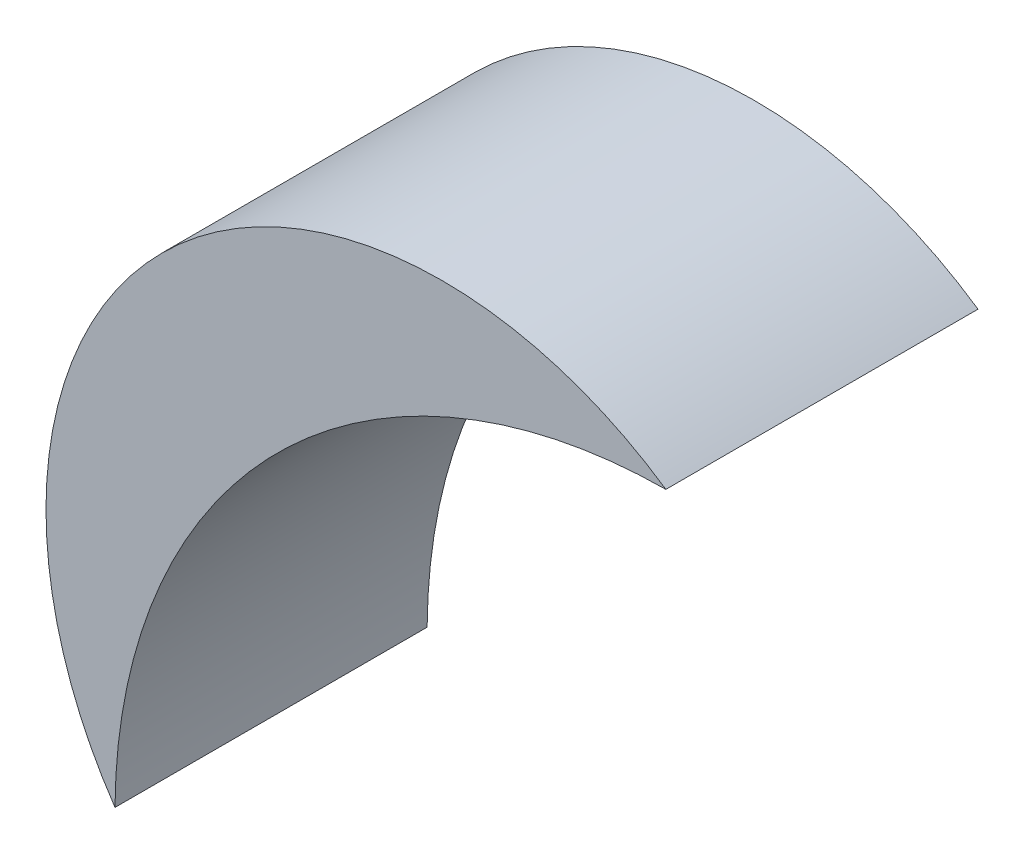
ISO-10303-21;
HEADER;
FILE_DESCRIPTION(('STEP AP214'),'2;1');
FILE_NAME('part.step','',(''),(''),'','','');
FILE_SCHEMA(('AUTOMOTIVE_DESIGN { 1 0 10303 214 1 1 1 1 }'));
ENDSEC;
DATA;
#1=APPLICATION_CONTEXT('core data for automotive mechanical design processes');
#2=APPLICATION_PROTOCOL_DEFINITION('international standard','automotive_design',2000,#1);
#3=PRODUCT_CONTEXT('',#1,'mechanical');
#4=PRODUCT('Part','Part','',(#3));
#5=PRODUCT_RELATED_PRODUCT_CATEGORY('part','',(#4));
#6=PRODUCT_DEFINITION_FORMATION('','',#4);
#7=PRODUCT_DEFINITION_CONTEXT('part definition',#1,'design');
#8=PRODUCT_DEFINITION('design','',#6,#7);
#9=PRODUCT_DEFINITION_SHAPE('','',#8);
#10=(LENGTH_UNIT() NAMED_UNIT(*) SI_UNIT(.MILLI.,.METRE.));
#11=(NAMED_UNIT(*) PLANE_ANGLE_UNIT() SI_UNIT($,.RADIAN.));
#12=(NAMED_UNIT(*) SI_UNIT($,.STERADIAN.) SOLID_ANGLE_UNIT());
#13=UNCERTAINTY_MEASURE_WITH_UNIT(LENGTH_MEASURE(1.E-05),#10,'distance_accuracy_value','');
#14=(GEOMETRIC_REPRESENTATION_CONTEXT(3) GLOBAL_UNCERTAINTY_ASSIGNED_CONTEXT((#13)) GLOBAL_UNIT_ASSIGNED_CONTEXT((#10,
#11,#12)) REPRESENTATION_CONTEXT('',''));
#15=CARTESIAN_POINT('',(0.,0.,0.));
#16=DIRECTION('',(0.,0.,1.));
#17=DIRECTION('',(1.,0.,0.));
#18=AXIS2_PLACEMENT_3D('',#15,#16,#17);
#19=CARTESIAN_POINT('',(119.253,97.917,0.));
#20=DIRECTION('',(0.,0.,-1.));
#21=DIRECTION('',(1.,0.,0.));
#22=AXIS2_PLACEMENT_3D('',#19,#20,#21);
#23=CYLINDRICAL_SURFACE('',#22,0.3556);
#24=DIRECTION('',(0.,0.,1.));
#25=VECTOR('',#24,1.);
#26=CARTESIAN_POINT('',(119.250390872619,98.2725904279565,0.));
#27=LINE('',#26,#25);
#28=CARTESIAN_POINT('',(119.250390872619,98.2725904279565,0.));
#29=VERTEX_POINT('',#28);
#30=CARTESIAN_POINT('',(119.250390872619,98.2725904279565,0.1999996));
#31=VERTEX_POINT('',#30);
#32=EDGE_CURVE('E11',#29,#31,#27,.T.);
#33=ORIENTED_EDGE('',*,*,#32,.T.);
#34=CARTESIAN_POINT('',(119.253,97.917,0.1999996));
#35=DIRECTION('',(0.,0.,1.));
#36=DIRECTION('',(1.,0.,0.));
#37=AXIS2_PLACEMENT_3D('',#34,#35,#36);
#38=CIRCLE('',#37,0.3556);
#39=CARTESIAN_POINT('',(118.897409572043,97.9196091273805,0.1999996));
#40=VERTEX_POINT('',#39);
#41=EDGE_CURVE('E24',#31,#40,#38,.T.);
#42=ORIENTED_EDGE('',*,*,#41,.T.);
#43=DIRECTION('',(0.,0.,1.));
#44=VECTOR('',#43,1.);
#45=CARTESIAN_POINT('',(118.897409572043,97.9196091273805,0.));
#46=LINE('',#45,#44);
#47=CARTESIAN_POINT('',(118.897409572043,97.9196091273805,0.));
#48=VERTEX_POINT('',#47);
#49=EDGE_CURVE('E40',#48,#40,#46,.T.);
#50=ORIENTED_EDGE('',*,*,#49,.F.);
#51=CARTESIAN_POINT('',(119.253,97.917,0.));
#52=DIRECTION('',(0.,0.,1.));
#53=DIRECTION('',(1.,0.,0.));
#54=AXIS2_PLACEMENT_3D('',#51,#52,#53);
#55=CIRCLE('',#54,0.3556);
#56=EDGE_CURVE('E42',#29,#48,#55,.T.);
#57=ORIENTED_EDGE('',*,*,#56,.F.);
#58=EDGE_LOOP('',(#33,#42,#50,#57));
#59=FACE_BOUND('',#58,.T.);
#60=ADVANCED_FACE('F17',(#59),#23,.F.);
#61=CARTESIAN_POINT('',(119.10720019,98.06279981,0.));
#62=DIRECTION('',(0.,0.,-1.));
#63=DIRECTION('',(0.707106781186548,0.707106781186548,0.));
#64=AXIS2_PLACEMENT_3D('',#61,#62,#63);
#65=CYLINDRICAL_SURFACE('',#64,0.253999360179542);
#66=CARTESIAN_POINT('',(119.10720019,98.06279981,0.1999996));
#67=DIRECTION('',(0.,0.,1.));
#68=DIRECTION('',(0.707106781186548,0.707106781186548,0.));
#69=AXIS2_PLACEMENT_3D('',#66,#67,#68);
#70=CIRCLE('',#69,0.253999360179542);
#71=EDGE_CURVE('E49',#31,#40,#70,.T.);
#72=ORIENTED_EDGE('',*,*,#71,.F.);
#73=ORIENTED_EDGE('',*,*,#32,.F.);
#74=CARTESIAN_POINT('',(119.10720019,98.06279981,0.));
#75=DIRECTION('',(0.,0.,1.));
#76=DIRECTION('',(0.707106781186548,0.707106781186548,0.));
#77=AXIS2_PLACEMENT_3D('',#74,#75,#76);
#78=CIRCLE('',#77,0.253999360179542);
#79=EDGE_CURVE('E48',#29,#48,#78,.T.);
#80=ORIENTED_EDGE('',*,*,#79,.T.);
#81=ORIENTED_EDGE('',*,*,#49,.T.);
#82=EDGE_LOOP('',(#72,#73,#80,#81));
#83=FACE_BOUND('',#82,.T.);
#84=ADVANCED_FACE('F51',(#83),#65,.T.);
#85=CARTESIAN_POINT('',(118.92759552,97.88319514,0.));
#86=DIRECTION('',(0.,0.,-1.));
#87=DIRECTION('',(-1.,0.,0.));
#88=AXIS2_PLACEMENT_3D('',#85,#86,#87);
#89=PLANE('',#88);
#90=ORIENTED_EDGE('',*,*,#56,.T.);
#91=ORIENTED_EDGE('',*,*,#79,.F.);
#92=EDGE_LOOP('',(#90,#91));
#93=FACE_BOUND('',#92,.T.);
#94=ADVANCED_FACE('F47',(#93),#89,.T.);
#95=CARTESIAN_POINT('',(118.92759552,97.88319514,0.1999996));
#96=DIRECTION('',(0.,0.,-1.));
#97=DIRECTION('',(-1.,0.,0.));
#98=AXIS2_PLACEMENT_3D('',#95,#96,#97);
#99=PLANE('',#98);
#100=ORIENTED_EDGE('',*,*,#71,.T.);
#101=ORIENTED_EDGE('',*,*,#41,.F.);
#102=EDGE_LOOP('',(#100,#101));
#103=FACE_BOUND('',#102,.T.);
#104=ADVANCED_FACE('F55',(#103),#99,.F.);
#105=CLOSED_SHELL('',(#60,#84,#94,#104));
#106=MANIFOLD_SOLID_BREP('B1',#105);
#107=ADVANCED_BREP_SHAPE_REPRESENTATION('',(#18,#106),#14);
#108=SHAPE_DEFINITION_REPRESENTATION(#9,#107);
ENDSEC;
END-ISO-10303-21;
